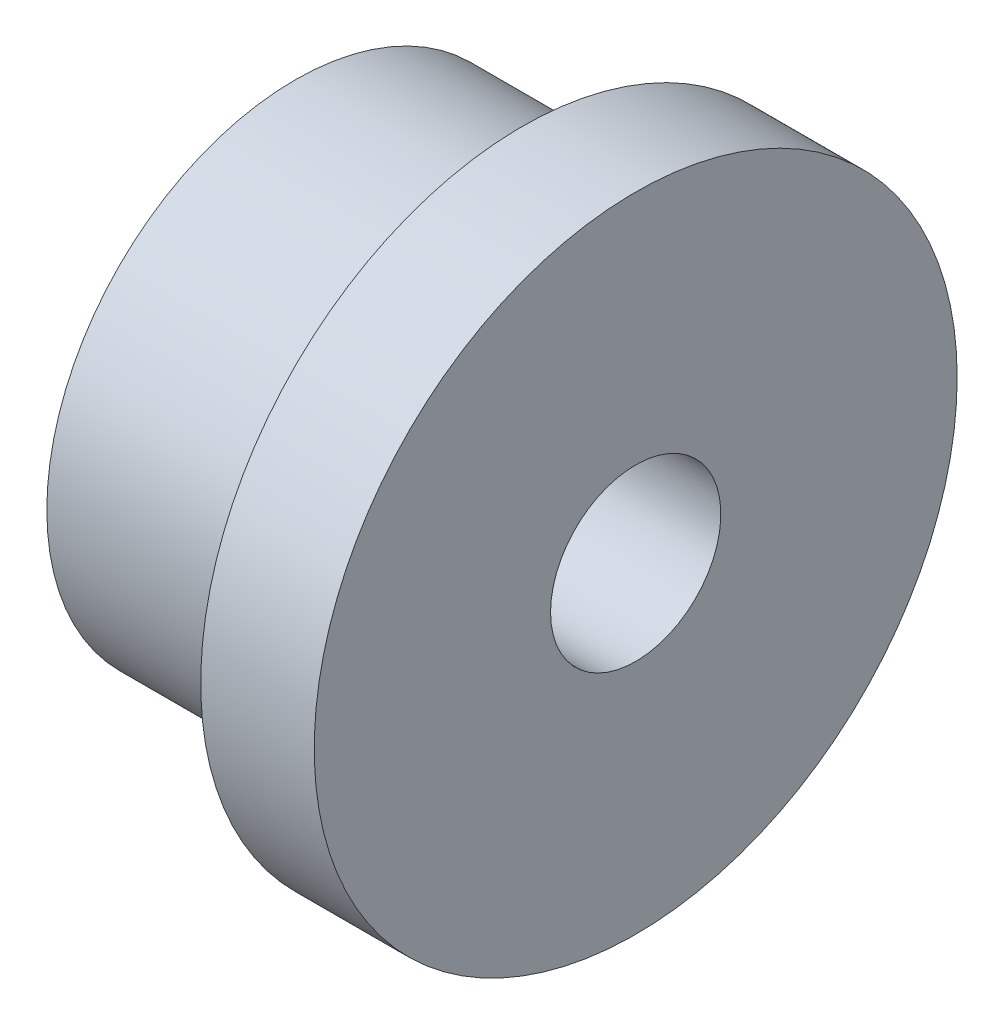
ISO-10303-21;
HEADER;
FILE_DESCRIPTION(('STEP AP214'),'2;1');
FILE_NAME('part.step','',(''),(''),'','','');
FILE_SCHEMA(('AUTOMOTIVE_DESIGN { 1 0 10303 214 1 1 1 1 }'));
ENDSEC;
DATA;
#1=APPLICATION_CONTEXT('core data for automotive mechanical design processes');
#2=APPLICATION_PROTOCOL_DEFINITION('international standard','automotive_design',2000,#1);
#3=PRODUCT_CONTEXT('',#1,'mechanical');
#4=PRODUCT('Part','Part','',(#3));
#5=PRODUCT_RELATED_PRODUCT_CATEGORY('part','',(#4));
#6=PRODUCT_DEFINITION_FORMATION('','',#4);
#7=PRODUCT_DEFINITION_CONTEXT('part definition',#1,'design');
#8=PRODUCT_DEFINITION('design','',#6,#7);
#9=PRODUCT_DEFINITION_SHAPE('','',#8);
#10=(LENGTH_UNIT() NAMED_UNIT(*) SI_UNIT(.MILLI.,.METRE.));
#11=(NAMED_UNIT(*) PLANE_ANGLE_UNIT() SI_UNIT($,.RADIAN.));
#12=(NAMED_UNIT(*) SI_UNIT($,.STERADIAN.) SOLID_ANGLE_UNIT());
#13=UNCERTAINTY_MEASURE_WITH_UNIT(LENGTH_MEASURE(1.E-05),#10,'distance_accuracy_value','');
#14=(GEOMETRIC_REPRESENTATION_CONTEXT(3) GLOBAL_UNCERTAINTY_ASSIGNED_CONTEXT((#13)) GLOBAL_UNIT_ASSIGNED_CONTEXT((#10,
#11,#12)) REPRESENTATION_CONTEXT('',''));
#15=CARTESIAN_POINT('',(0.,0.,0.));
#16=DIRECTION('',(0.,0.,1.));
#17=DIRECTION('',(1.,0.,0.));
#18=AXIS2_PLACEMENT_3D('',#15,#16,#17);
#19=CARTESIAN_POINT('',(0.,0.,0.));
#20=DIRECTION('',(1.,0.,0.));
#21=DIRECTION('',(0.,0.,-1.));
#22=AXIS2_PLACEMENT_3D('',#19,#20,#21);
#23=PLANE('',#22);
#24=CARTESIAN_POINT('',(0.,0.,0.));
#25=DIRECTION('',(1.,0.,0.));
#26=DIRECTION('',(0.,0.,-1.));
#27=AXIS2_PLACEMENT_3D('',#24,#25,#26);
#28=CIRCLE('',#27,8.99159999999999);
#29=CARTESIAN_POINT('',(0.,0.,-8.99159999999999));
#30=VERTEX_POINT('',#29);
#31=EDGE_CURVE('E42',#30,#30,#28,.T.);
#32=ORIENTED_EDGE('',*,*,#31,.F.);
#33=EDGE_LOOP('',(#32));
#34=FACE_BOUND('',#33,.T.);
#35=CARTESIAN_POINT('',(0.,0.,0.));
#36=DIRECTION('',(1.,0.,0.));
#37=DIRECTION('',(0.,0.,-1.));
#38=AXIS2_PLACEMENT_3D('',#35,#36,#37);
#39=CIRCLE('',#38,6.9453125);
#40=CARTESIAN_POINT('',(0.,0.,-6.9453125));
#41=VERTEX_POINT('',#40);
#42=EDGE_CURVE('E10',#41,#41,#39,.F.);
#43=ORIENTED_EDGE('',*,*,#42,.F.);
#44=EDGE_LOOP('',(#43));
#45=FACE_BOUND('',#44,.T.);
#46=ADVANCED_FACE('F31',(#34,#45),#23,.F.);
#47=CARTESIAN_POINT('',(3.175,0.,0.));
#48=DIRECTION('',(-1.,0.,0.));
#49=DIRECTION('',(0.,0.,1.));
#50=AXIS2_PLACEMENT_3D('',#47,#48,#49);
#51=CYLINDRICAL_SURFACE('',#50,8.99159999999999);
#52=CARTESIAN_POINT('',(3.175,0.,0.));
#53=DIRECTION('',(1.,0.,0.));
#54=DIRECTION('',(0.,0.,-1.));
#55=AXIS2_PLACEMENT_3D('',#52,#53,#54);
#56=CIRCLE('',#55,8.99159999999999);
#57=CARTESIAN_POINT('',(3.175,0.,-8.99159999999999));
#58=VERTEX_POINT('',#57);
#59=EDGE_CURVE('E38',#58,#58,#56,.T.);
#60=ORIENTED_EDGE('',*,*,#59,.F.);
#61=EDGE_LOOP('',(#60));
#62=FACE_BOUND('',#61,.T.);
#63=ORIENTED_EDGE('',*,*,#31,.T.);
#64=EDGE_LOOP('',(#63));
#65=FACE_BOUND('',#64,.T.);
#66=ADVANCED_FACE('F33',(#62,#65),#51,.T.);
#67=CARTESIAN_POINT('',(3.175,0.,0.));
#68=DIRECTION('',(1.,0.,0.));
#69=DIRECTION('',(0.,0.,-1.));
#70=AXIS2_PLACEMENT_3D('',#67,#68,#69);
#71=PLANE('',#70);
#72=CARTESIAN_POINT('',(3.175,0.,0.));
#73=DIRECTION('',(-1.,0.,0.));
#74=DIRECTION('',(0.,0.,1.));
#75=AXIS2_PLACEMENT_3D('',#72,#73,#74);
#76=CIRCLE('',#75,2.38125);
#77=CARTESIAN_POINT('',(3.175,0.,2.38125));
#78=VERTEX_POINT('',#77);
#79=EDGE_CURVE('E51',#78,#78,#76,.T.);
#80=ORIENTED_EDGE('',*,*,#79,.T.);
#81=EDGE_LOOP('',(#80));
#82=FACE_BOUND('',#81,.T.);
#83=ORIENTED_EDGE('',*,*,#59,.T.);
#84=EDGE_LOOP('',(#83));
#85=FACE_BOUND('',#84,.T.);
#86=ADVANCED_FACE('F68',(#82,#85),#71,.T.);
#87=CARTESIAN_POINT('',(-6.35,0.,0.));
#88=DIRECTION('',(1.,0.,0.));
#89=DIRECTION('',(0.,0.,-1.));
#90=AXIS2_PLACEMENT_3D('',#87,#88,#89);
#91=CYLINDRICAL_SURFACE('',#90,6.9453125);
#92=CARTESIAN_POINT('',(-6.35,0.,0.));
#93=DIRECTION('',(-1.,0.,0.));
#94=DIRECTION('',(0.,0.,1.));
#95=AXIS2_PLACEMENT_3D('',#92,#93,#94);
#96=CIRCLE('',#95,6.9453125);
#97=CARTESIAN_POINT('',(-6.35,0.,6.9453125));
#98=VERTEX_POINT('',#97);
#99=EDGE_CURVE('E47',#98,#98,#96,.T.);
#100=ORIENTED_EDGE('',*,*,#99,.F.);
#101=EDGE_LOOP('',(#100));
#102=FACE_BOUND('',#101,.T.);
#103=ORIENTED_EDGE('',*,*,#42,.T.);
#104=EDGE_LOOP('',(#103));
#105=FACE_BOUND('',#104,.T.);
#106=ADVANCED_FACE('F63',(#102,#105),#91,.T.);
#107=CARTESIAN_POINT('',(-6.35,0.,0.));
#108=DIRECTION('',(-1.,0.,0.));
#109=DIRECTION('',(0.,0.,1.));
#110=AXIS2_PLACEMENT_3D('',#107,#108,#109);
#111=PLANE('',#110);
#112=CARTESIAN_POINT('',(-6.35,0.,0.));
#113=DIRECTION('',(-1.,0.,0.));
#114=DIRECTION('',(0.,0.,1.));
#115=AXIS2_PLACEMENT_3D('',#112,#113,#114);
#116=CIRCLE('',#115,2.38125);
#117=CARTESIAN_POINT('',(-6.35,0.,2.38125));
#118=VERTEX_POINT('',#117);
#119=EDGE_CURVE('E54',#118,#118,#116,.T.);
#120=ORIENTED_EDGE('',*,*,#119,.F.);
#121=EDGE_LOOP('',(#120));
#122=FACE_BOUND('',#121,.T.);
#123=ORIENTED_EDGE('',*,*,#99,.T.);
#124=EDGE_LOOP('',(#123));
#125=FACE_BOUND('',#124,.T.);
#126=ADVANCED_FACE('F60',(#122,#125),#111,.T.);
#127=CARTESIAN_POINT('',(-6.35,0.,0.));
#128=DIRECTION('',(-1.,0.,0.));
#129=DIRECTION('',(0.,0.,1.));
#130=AXIS2_PLACEMENT_3D('',#127,#128,#129);
#131=CYLINDRICAL_SURFACE('',#130,2.38125);
#132=ORIENTED_EDGE('',*,*,#79,.F.);
#133=EDGE_LOOP('',(#132));
#134=FACE_BOUND('',#133,.T.);
#135=ORIENTED_EDGE('',*,*,#119,.T.);
#136=EDGE_LOOP('',(#135));
#137=FACE_BOUND('',#136,.T.);
#138=ADVANCED_FACE('F58',(#134,#137),#131,.F.);
#139=CLOSED_SHELL('',(#46,#66,#86,#106,#126,#138));
#140=MANIFOLD_SOLID_BREP('B2',#139);
#141=ADVANCED_BREP_SHAPE_REPRESENTATION('',(#18,#140),#14);
#142=SHAPE_DEFINITION_REPRESENTATION(#9,#141);
ENDSEC;
END-ISO-10303-21;
